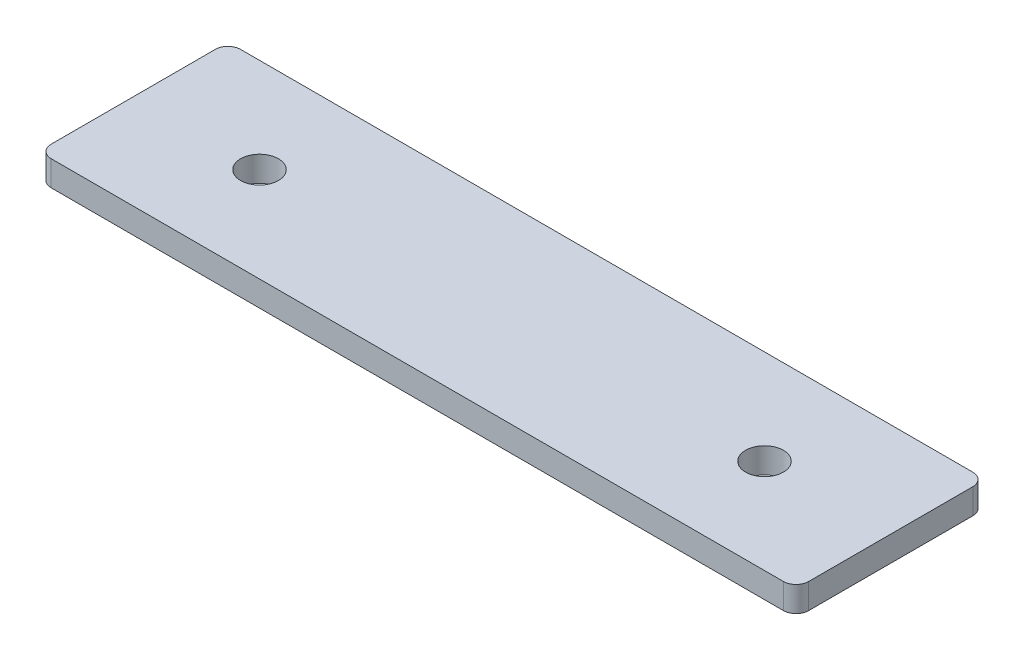
ISO-10303-21;
HEADER;
FILE_DESCRIPTION(('STEP AP214'),'2;1');
FILE_NAME('part.step','',(''),(''),'','','');
FILE_SCHEMA(('AUTOMOTIVE_DESIGN { 1 0 10303 214 1 1 1 1 }'));
ENDSEC;
DATA;
#1=APPLICATION_CONTEXT('core data for automotive mechanical design processes');
#2=APPLICATION_PROTOCOL_DEFINITION('international standard','automotive_design',2000,#1);
#3=PRODUCT_CONTEXT('',#1,'mechanical');
#4=PRODUCT('Part','Part','',(#3));
#5=PRODUCT_RELATED_PRODUCT_CATEGORY('part','',(#4));
#6=PRODUCT_DEFINITION_FORMATION('','',#4);
#7=PRODUCT_DEFINITION_CONTEXT('part definition',#1,'design');
#8=PRODUCT_DEFINITION('design','',#6,#7);
#9=PRODUCT_DEFINITION_SHAPE('','',#8);
#10=(LENGTH_UNIT() NAMED_UNIT(*) SI_UNIT(.MILLI.,.METRE.));
#11=(NAMED_UNIT(*) PLANE_ANGLE_UNIT() SI_UNIT($,.RADIAN.));
#12=(NAMED_UNIT(*) SI_UNIT($,.STERADIAN.) SOLID_ANGLE_UNIT());
#13=UNCERTAINTY_MEASURE_WITH_UNIT(LENGTH_MEASURE(1.E-05),#10,'distance_accuracy_value','');
#14=(GEOMETRIC_REPRESENTATION_CONTEXT(3) GLOBAL_UNCERTAINTY_ASSIGNED_CONTEXT((#13)) GLOBAL_UNIT_ASSIGNED_CONTEXT((#10,
#11,#12)) REPRESENTATION_CONTEXT('',''));
#15=CARTESIAN_POINT('',(0.,0.,0.));
#16=DIRECTION('',(0.,0.,1.));
#17=DIRECTION('',(1.,0.,0.));
#18=AXIS2_PLACEMENT_3D('',#15,#16,#17);
#19=CARTESIAN_POINT('',(0.,2.,0.));
#20=DIRECTION('',(0.,0.,-1.));
#21=DIRECTION('',(-1.,0.,0.));
#22=AXIS2_PLACEMENT_3D('',#19,#20,#21);
#23=PLANE('',#22);
#24=DIRECTION('',(1.,0.,0.));
#25=VECTOR('',#24,1.);
#26=CARTESIAN_POINT('',(0.,0.,0.));
#27=LINE('',#26,#25);
#28=CARTESIAN_POINT('',(1.,0.,0.));
#29=VERTEX_POINT('',#28);
#30=CARTESIAN_POINT('',(59.,0.,0.));
#31=VERTEX_POINT('',#30);
#32=EDGE_CURVE('E160',#29,#31,#27,.T.);
#33=ORIENTED_EDGE('',*,*,#32,.T.);
#34=DIRECTION('',(0.,-1.,0.));
#35=VECTOR('',#34,1.);
#36=CARTESIAN_POINT('',(59.,2.,0.));
#37=LINE('',#36,#35);
#38=CARTESIAN_POINT('',(59.,2.,0.));
#39=VERTEX_POINT('',#38);
#40=EDGE_CURVE('E147',#31,#39,#37,.F.);
#41=ORIENTED_EDGE('',*,*,#40,.T.);
#42=DIRECTION('',(1.,0.,0.));
#43=VECTOR('',#42,1.);
#44=CARTESIAN_POINT('',(0.,2.,0.));
#45=LINE('',#44,#43);
#46=CARTESIAN_POINT('',(1.,2.,0.));
#47=VERTEX_POINT('',#46);
#48=EDGE_CURVE('E162',#47,#39,#45,.T.);
#49=ORIENTED_EDGE('',*,*,#48,.F.);
#50=DIRECTION('',(0.,-1.,0.));
#51=VECTOR('',#50,1.);
#52=CARTESIAN_POINT('',(1.,0.,0.));
#53=LINE('',#52,#51);
#54=EDGE_CURVE('E144',#47,#29,#53,.T.);
#55=ORIENTED_EDGE('',*,*,#54,.T.);
#56=EDGE_LOOP('',(#33,#41,#49,#55));
#57=FACE_BOUND('',#56,.T.);
#58=ADVANCED_FACE('F35',(#57),#23,.F.);
#59=CARTESIAN_POINT('',(60.,2.,0.));
#60=DIRECTION('',(-1.,0.,0.));
#61=DIRECTION('',(0.,0.,1.));
#62=AXIS2_PLACEMENT_3D('',#59,#60,#61);
#63=PLANE('',#62);
#64=DIRECTION('',(0.,0.,-1.));
#65=VECTOR('',#64,1.);
#66=CARTESIAN_POINT('',(60.,0.,0.));
#67=LINE('',#66,#65);
#68=CARTESIAN_POINT('',(60.,0.,-1.));
#69=VERTEX_POINT('',#68);
#70=CARTESIAN_POINT('',(60.,0.,-14.));
#71=VERTEX_POINT('',#70);
#72=EDGE_CURVE('E118',#69,#71,#67,.T.);
#73=ORIENTED_EDGE('',*,*,#72,.T.);
#74=DIRECTION('',(0.,-1.,0.));
#75=VECTOR('',#74,1.);
#76=CARTESIAN_POINT('',(60.,2.,-14.));
#77=LINE('',#76,#75);
#78=CARTESIAN_POINT('',(60.,2.,-14.));
#79=VERTEX_POINT('',#78);
#80=EDGE_CURVE('E135',#71,#79,#77,.F.);
#81=ORIENTED_EDGE('',*,*,#80,.T.);
#82=DIRECTION('',(0.,0.,-1.));
#83=VECTOR('',#82,1.);
#84=CARTESIAN_POINT('',(60.,2.,0.));
#85=LINE('',#84,#83);
#86=CARTESIAN_POINT('',(60.,2.,-1.));
#87=VERTEX_POINT('',#86);
#88=EDGE_CURVE('E175',#87,#79,#85,.T.);
#89=ORIENTED_EDGE('',*,*,#88,.F.);
#90=DIRECTION('',(0.,-1.,0.));
#91=VECTOR('',#90,1.);
#92=CARTESIAN_POINT('',(60.,2.,-1.));
#93=LINE('',#92,#91);
#94=EDGE_CURVE('E132',#87,#69,#93,.T.);
#95=ORIENTED_EDGE('',*,*,#94,.T.);
#96=EDGE_LOOP('',(#73,#81,#89,#95));
#97=FACE_BOUND('',#96,.T.);
#98=ADVANCED_FACE('F212',(#97),#63,.F.);
#99=CARTESIAN_POINT('',(0.,2.,-15.));
#100=DIRECTION('',(0.,0.,-1.));
#101=DIRECTION('',(-1.,0.,0.));
#102=AXIS2_PLACEMENT_3D('',#99,#100,#101);
#103=PLANE('',#102);
#104=DIRECTION('',(1.,0.,0.));
#105=VECTOR('',#104,1.);
#106=CARTESIAN_POINT('',(0.,2.,-15.));
#107=LINE('',#106,#105);
#108=CARTESIAN_POINT('',(1.,2.,-15.));
#109=VERTEX_POINT('',#108);
#110=CARTESIAN_POINT('',(59.,2.,-15.));
#111=VERTEX_POINT('',#110);
#112=EDGE_CURVE('E123',#109,#111,#107,.T.);
#113=ORIENTED_EDGE('',*,*,#112,.T.);
#114=DIRECTION('',(0.,-1.,0.));
#115=VECTOR('',#114,1.);
#116=CARTESIAN_POINT('',(59.,0.,-15.));
#117=LINE('',#116,#115);
#118=CARTESIAN_POINT('',(59.,0.,-15.));
#119=VERTEX_POINT('',#118);
#120=EDGE_CURVE('E110',#111,#119,#117,.T.);
#121=ORIENTED_EDGE('',*,*,#120,.T.);
#122=DIRECTION('',(1.,0.,0.));
#123=VECTOR('',#122,1.);
#124=CARTESIAN_POINT('',(0.,0.,-15.));
#125=LINE('',#124,#123);
#126=CARTESIAN_POINT('',(1.,0.,-15.));
#127=VERTEX_POINT('',#126);
#128=EDGE_CURVE('E103',#127,#119,#125,.T.);
#129=ORIENTED_EDGE('',*,*,#128,.F.);
#130=DIRECTION('',(0.,-1.,0.));
#131=VECTOR('',#130,1.);
#132=CARTESIAN_POINT('',(1.,2.,-15.));
#133=LINE('',#132,#131);
#134=EDGE_CURVE('E116',#127,#109,#133,.F.);
#135=ORIENTED_EDGE('',*,*,#134,.T.);
#136=EDGE_LOOP('',(#113,#121,#129,#135));
#137=FACE_BOUND('',#136,.T.);
#138=ADVANCED_FACE('F115',(#137),#103,.T.);
#139=CARTESIAN_POINT('',(50.,2.,-7.5));
#140=DIRECTION('',(0.,-1.,0.));
#141=DIRECTION('',(0.,0.,-1.));
#142=AXIS2_PLACEMENT_3D('',#139,#140,#141);
#143=CYLINDRICAL_SURFACE('',#142,1.5);
#144=CARTESIAN_POINT('',(50.,2.,-7.5));
#145=DIRECTION('',(0.,1.,0.));
#146=DIRECTION('',(0.,0.,1.));
#147=AXIS2_PLACEMENT_3D('',#144,#145,#146);
#148=CIRCLE('',#147,1.5);
#149=CARTESIAN_POINT('',(50.,2.,-5.99999999999999));
#150=VERTEX_POINT('',#149);
#151=EDGE_CURVE('E178',#150,#150,#148,.T.);
#152=ORIENTED_EDGE('',*,*,#151,.T.);
#153=EDGE_LOOP('',(#152));
#154=FACE_BOUND('',#153,.T.);
#155=CARTESIAN_POINT('',(50.,0.,-7.5));
#156=DIRECTION('',(0.,1.,0.));
#157=DIRECTION('',(0.,0.,1.));
#158=AXIS2_PLACEMENT_3D('',#155,#156,#157);
#159=CIRCLE('',#158,1.5);
#160=CARTESIAN_POINT('',(50.,0.,-5.99999999999999));
#161=VERTEX_POINT('',#160);
#162=EDGE_CURVE('E164',#161,#161,#159,.T.);
#163=ORIENTED_EDGE('',*,*,#162,.F.);
#164=EDGE_LOOP('',(#163));
#165=FACE_BOUND('',#164,.T.);
#166=ADVANCED_FACE('F193',(#154,#165),#143,.F.);
#167=CARTESIAN_POINT('',(10.,2.,-7.49999999999999));
#168=DIRECTION('',(0.,-1.,0.));
#169=DIRECTION('',(0.,0.,-1.));
#170=AXIS2_PLACEMENT_3D('',#167,#168,#169);
#171=CYLINDRICAL_SURFACE('',#170,1.5);
#172=CARTESIAN_POINT('',(10.,2.,-7.49999999999999));
#173=DIRECTION('',(0.,1.,0.));
#174=DIRECTION('',(0.,0.,1.));
#175=AXIS2_PLACEMENT_3D('',#172,#173,#174);
#176=CIRCLE('',#175,1.5);
#177=CARTESIAN_POINT('',(10.,2.,-5.99999999999999));
#178=VERTEX_POINT('',#177);
#179=EDGE_CURVE('E181',#178,#178,#176,.T.);
#180=ORIENTED_EDGE('',*,*,#179,.T.);
#181=EDGE_LOOP('',(#180));
#182=FACE_BOUND('',#181,.T.);
#183=CARTESIAN_POINT('',(10.,0.,-7.49999999999999));
#184=DIRECTION('',(0.,1.,0.));
#185=DIRECTION('',(0.,0.,1.));
#186=AXIS2_PLACEMENT_3D('',#183,#184,#185);
#187=CIRCLE('',#186,1.5);
#188=CARTESIAN_POINT('',(10.,0.,-5.99999999999999));
#189=VERTEX_POINT('',#188);
#190=EDGE_CURVE('E169',#189,#189,#187,.T.);
#191=ORIENTED_EDGE('',*,*,#190,.F.);
#192=EDGE_LOOP('',(#191));
#193=FACE_BOUND('',#192,.T.);
#194=ADVANCED_FACE('F185',(#182,#193),#171,.F.);
#195=CARTESIAN_POINT('',(0.,2.,0.));
#196=DIRECTION('',(-1.,0.,0.));
#197=DIRECTION('',(0.,0.,1.));
#198=AXIS2_PLACEMENT_3D('',#195,#196,#197);
#199=PLANE('',#198);
#200=DIRECTION('',(0.,0.,-1.));
#201=VECTOR('',#200,1.);
#202=CARTESIAN_POINT('',(0.,0.,0.));
#203=LINE('',#202,#201);
#204=CARTESIAN_POINT('',(0.,0.,-1.));
#205=VERTEX_POINT('',#204);
#206=CARTESIAN_POINT('',(0.,0.,-14.));
#207=VERTEX_POINT('',#206);
#208=EDGE_CURVE('E104',#205,#207,#203,.T.);
#209=ORIENTED_EDGE('',*,*,#208,.F.);
#210=DIRECTION('',(0.,-1.,0.));
#211=VECTOR('',#210,1.);
#212=CARTESIAN_POINT('',(0.,2.,-1.));
#213=LINE('',#212,#211);
#214=CARTESIAN_POINT('',(0.,2.,-1.));
#215=VERTEX_POINT('',#214);
#216=EDGE_CURVE('E11',#205,#215,#213,.F.);
#217=ORIENTED_EDGE('',*,*,#216,.T.);
#218=DIRECTION('',(0.,0.,-1.));
#219=VECTOR('',#218,1.);
#220=CARTESIAN_POINT('',(0.,2.,0.));
#221=LINE('',#220,#219);
#222=CARTESIAN_POINT('',(0.,2.,-14.));
#223=VERTEX_POINT('',#222);
#224=EDGE_CURVE('E120',#215,#223,#221,.T.);
#225=ORIENTED_EDGE('',*,*,#224,.T.);
#226=DIRECTION('',(0.,-1.,0.));
#227=VECTOR('',#226,1.);
#228=CARTESIAN_POINT('',(0.,2.,-14.));
#229=LINE('',#228,#227);
#230=EDGE_CURVE('E43',#223,#207,#229,.T.);
#231=ORIENTED_EDGE('',*,*,#230,.T.);
#232=EDGE_LOOP('',(#209,#217,#225,#231));
#233=FACE_BOUND('',#232,.T.);
#234=ADVANCED_FACE('F148',(#233),#199,.T.);
#235=CARTESIAN_POINT('',(0.,2.,0.));
#236=DIRECTION('',(0.,1.,0.));
#237=DIRECTION('',(0.,0.,1.));
#238=AXIS2_PLACEMENT_3D('',#235,#236,#237);
#239=PLANE('',#238);
#240=ORIENTED_EDGE('',*,*,#179,.F.);
#241=EDGE_LOOP('',(#240));
#242=FACE_BOUND('',#241,.T.);
#243=ORIENTED_EDGE('',*,*,#151,.F.);
#244=EDGE_LOOP('',(#243));
#245=FACE_BOUND('',#244,.T.);
#246=ORIENTED_EDGE('',*,*,#88,.T.);
#247=CARTESIAN_POINT('',(59.,2.,-14.));
#248=DIRECTION('',(0.,1.,0.));
#249=DIRECTION('',(0.,0.,1.));
#250=AXIS2_PLACEMENT_3D('',#247,#248,#249);
#251=CIRCLE('',#250,1.);
#252=EDGE_CURVE('E142',#79,#111,#251,.T.);
#253=ORIENTED_EDGE('',*,*,#252,.T.);
#254=ORIENTED_EDGE('',*,*,#112,.F.);
#255=CARTESIAN_POINT('',(1.,2.,-14.));
#256=DIRECTION('',(0.,1.,0.));
#257=DIRECTION('',(0.,0.,1.));
#258=AXIS2_PLACEMENT_3D('',#255,#256,#257);
#259=CIRCLE('',#258,1.);
#260=EDGE_CURVE('E50',#109,#223,#259,.T.);
#261=ORIENTED_EDGE('',*,*,#260,.T.);
#262=ORIENTED_EDGE('',*,*,#224,.F.);
#263=CARTESIAN_POINT('',(1.,2.,-1.));
#264=DIRECTION('',(0.,1.,0.));
#265=DIRECTION('',(0.,0.,1.));
#266=AXIS2_PLACEMENT_3D('',#263,#264,#265);
#267=CIRCLE('',#266,1.);
#268=EDGE_CURVE('E138',#215,#47,#267,.T.);
#269=ORIENTED_EDGE('',*,*,#268,.T.);
#270=ORIENTED_EDGE('',*,*,#48,.T.);
#271=CARTESIAN_POINT('',(59.,2.,-1.));
#272=DIRECTION('',(0.,1.,0.));
#273=DIRECTION('',(0.,0.,1.));
#274=AXIS2_PLACEMENT_3D('',#271,#272,#273);
#275=CIRCLE('',#274,1.);
#276=EDGE_CURVE('E140',#39,#87,#275,.T.);
#277=ORIENTED_EDGE('',*,*,#276,.T.);
#278=EDGE_LOOP('',(#246,#253,#254,#261,#262,#269,#270,#277));
#279=FACE_BOUND('',#278,.T.);
#280=ADVANCED_FACE('F151',(#242,#245,#279),#239,.T.);
#281=CARTESIAN_POINT('',(0.,0.,0.));
#282=DIRECTION('',(0.,1.,0.));
#283=DIRECTION('',(0.,0.,1.));
#284=AXIS2_PLACEMENT_3D('',#281,#282,#283);
#285=PLANE('',#284);
#286=ORIENTED_EDGE('',*,*,#190,.T.);
#287=EDGE_LOOP('',(#286));
#288=FACE_BOUND('',#287,.T.);
#289=ORIENTED_EDGE('',*,*,#162,.T.);
#290=EDGE_LOOP('',(#289));
#291=FACE_BOUND('',#290,.T.);
#292=ORIENTED_EDGE('',*,*,#128,.T.);
#293=CARTESIAN_POINT('',(59.,0.,-14.));
#294=DIRECTION('',(0.,1.,0.));
#295=DIRECTION('',(0.,0.,1.));
#296=AXIS2_PLACEMENT_3D('',#293,#294,#295);
#297=CIRCLE('',#296,1.);
#298=EDGE_CURVE('E130',#119,#71,#297,.F.);
#299=ORIENTED_EDGE('',*,*,#298,.T.);
#300=ORIENTED_EDGE('',*,*,#72,.F.);
#301=CARTESIAN_POINT('',(59.,0.,-1.));
#302=DIRECTION('',(0.,1.,0.));
#303=DIRECTION('',(0.,0.,1.));
#304=AXIS2_PLACEMENT_3D('',#301,#302,#303);
#305=CIRCLE('',#304,1.);
#306=EDGE_CURVE('E128',#69,#31,#305,.F.);
#307=ORIENTED_EDGE('',*,*,#306,.T.);
#308=ORIENTED_EDGE('',*,*,#32,.F.);
#309=CARTESIAN_POINT('',(1.,0.,-1.));
#310=DIRECTION('',(0.,1.,0.));
#311=DIRECTION('',(0.,0.,1.));
#312=AXIS2_PLACEMENT_3D('',#309,#310,#311);
#313=CIRCLE('',#312,1.);
#314=EDGE_CURVE('E109',#29,#205,#313,.F.);
#315=ORIENTED_EDGE('',*,*,#314,.T.);
#316=ORIENTED_EDGE('',*,*,#208,.T.);
#317=CARTESIAN_POINT('',(1.,0.,-14.));
#318=DIRECTION('',(0.,1.,0.));
#319=DIRECTION('',(0.,0.,1.));
#320=AXIS2_PLACEMENT_3D('',#317,#318,#319);
#321=CIRCLE('',#320,1.);
#322=EDGE_CURVE('E100',#207,#127,#321,.F.);
#323=ORIENTED_EDGE('',*,*,#322,.T.);
#324=EDGE_LOOP('',(#292,#299,#300,#307,#308,#315,#316,#323));
#325=FACE_BOUND('',#324,.T.);
#326=ADVANCED_FACE('F102',(#288,#291,#325),#285,.F.);
#327=CARTESIAN_POINT('',(59.,2.,-14.));
#328=DIRECTION('',(0.,1.,0.));
#329=DIRECTION('',(0.,0.,1.));
#330=AXIS2_PLACEMENT_3D('',#327,#328,#329);
#331=CYLINDRICAL_SURFACE('',#330,1.);
#332=ORIENTED_EDGE('',*,*,#252,.F.);
#333=ORIENTED_EDGE('',*,*,#80,.F.);
#334=ORIENTED_EDGE('',*,*,#298,.F.);
#335=ORIENTED_EDGE('',*,*,#120,.F.);
#336=EDGE_LOOP('',(#332,#333,#334,#335));
#337=FACE_BOUND('',#336,.T.);
#338=ADVANCED_FACE('F200',(#337),#331,.T.);
#339=CARTESIAN_POINT('',(59.,2.,-1.));
#340=DIRECTION('',(0.,-1.,0.));
#341=DIRECTION('',(0.,0.,-1.));
#342=AXIS2_PLACEMENT_3D('',#339,#340,#341);
#343=CYLINDRICAL_SURFACE('',#342,1.);
#344=ORIENTED_EDGE('',*,*,#276,.F.);
#345=ORIENTED_EDGE('',*,*,#40,.F.);
#346=ORIENTED_EDGE('',*,*,#306,.F.);
#347=ORIENTED_EDGE('',*,*,#94,.F.);
#348=EDGE_LOOP('',(#344,#345,#346,#347));
#349=FACE_BOUND('',#348,.T.);
#350=ADVANCED_FACE('F207',(#349),#343,.T.);
#351=CARTESIAN_POINT('',(1.,2.,-1.));
#352=DIRECTION('',(0.,1.,0.));
#353=DIRECTION('',(0.,0.,1.));
#354=AXIS2_PLACEMENT_3D('',#351,#352,#353);
#355=CYLINDRICAL_SURFACE('',#354,1.);
#356=ORIENTED_EDGE('',*,*,#268,.F.);
#357=ORIENTED_EDGE('',*,*,#216,.F.);
#358=ORIENTED_EDGE('',*,*,#314,.F.);
#359=ORIENTED_EDGE('',*,*,#54,.F.);
#360=EDGE_LOOP('',(#356,#357,#358,#359));
#361=FACE_BOUND('',#360,.T.);
#362=ADVANCED_FACE('F156',(#361),#355,.T.);
#363=CARTESIAN_POINT('',(1.,2.,-14.));
#364=DIRECTION('',(0.,-1.,0.));
#365=DIRECTION('',(0.,0.,-1.));
#366=AXIS2_PLACEMENT_3D('',#363,#364,#365);
#367=CYLINDRICAL_SURFACE('',#366,1.);
#368=ORIENTED_EDGE('',*,*,#260,.F.);
#369=ORIENTED_EDGE('',*,*,#134,.F.);
#370=ORIENTED_EDGE('',*,*,#322,.F.);
#371=ORIENTED_EDGE('',*,*,#230,.F.);
#372=EDGE_LOOP('',(#368,#369,#370,#371));
#373=FACE_BOUND('',#372,.T.);
#374=ADVANCED_FACE('F37',(#373),#367,.T.);
#375=CLOSED_SHELL('',(#58,#98,#138,#166,#194,#234,#280,#326,#338,#350,#362,#374));
#376=MANIFOLD_SOLID_BREP('B2',#375);
#377=ADVANCED_BREP_SHAPE_REPRESENTATION('',(#18,#376),#14);
#378=SHAPE_DEFINITION_REPRESENTATION(#9,#377);
ENDSEC;
END-ISO-10303-21;
